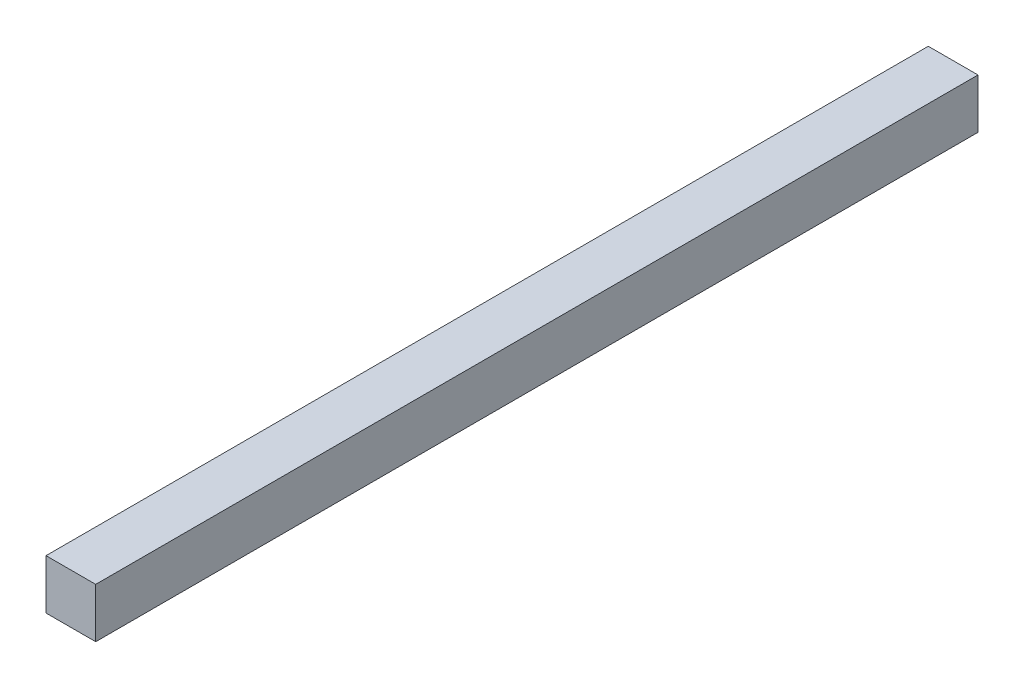
ISO-10303-21;
HEADER;
FILE_DESCRIPTION(('STEP AP214'),'2;1');
FILE_NAME('part.step','',(''),(''),'','','');
FILE_SCHEMA(('AUTOMOTIVE_DESIGN { 1 0 10303 214 1 1 1 1 }'));
ENDSEC;
DATA;
#1=APPLICATION_CONTEXT('core data for automotive mechanical design processes');
#2=APPLICATION_PROTOCOL_DEFINITION('international standard','automotive_design',2000,#1);
#3=PRODUCT_CONTEXT('',#1,'mechanical');
#4=PRODUCT('Part','Part','',(#3));
#5=PRODUCT_RELATED_PRODUCT_CATEGORY('part','',(#4));
#6=PRODUCT_DEFINITION_FORMATION('','',#4);
#7=PRODUCT_DEFINITION_CONTEXT('part definition',#1,'design');
#8=PRODUCT_DEFINITION('design','',#6,#7);
#9=PRODUCT_DEFINITION_SHAPE('','',#8);
#10=(LENGTH_UNIT() NAMED_UNIT(*) SI_UNIT(.MILLI.,.METRE.));
#11=(NAMED_UNIT(*) PLANE_ANGLE_UNIT() SI_UNIT($,.RADIAN.));
#12=(NAMED_UNIT(*) SI_UNIT($,.STERADIAN.) SOLID_ANGLE_UNIT());
#13=UNCERTAINTY_MEASURE_WITH_UNIT(LENGTH_MEASURE(1.E-05),#10,'distance_accuracy_value','');
#14=(GEOMETRIC_REPRESENTATION_CONTEXT(3) GLOBAL_UNCERTAINTY_ASSIGNED_CONTEXT((#13)) GLOBAL_UNIT_ASSIGNED_CONTEXT((#10,
#11,#12)) REPRESENTATION_CONTEXT('',''));
#15=CARTESIAN_POINT('',(0.,0.,0.));
#16=DIRECTION('',(0.,0.,1.));
#17=DIRECTION('',(1.,0.,0.));
#18=AXIS2_PLACEMENT_3D('',#15,#16,#17);
#19=CARTESIAN_POINT('',(-25.4358974358975,25.2307692307692,710.));
#20=DIRECTION('',(1.,0.,0.));
#21=DIRECTION('',(0.,1.,0.));
#22=AXIS2_PLACEMENT_3D('',#19,#20,#21);
#23=PLANE('',#22);
#24=DIRECTION('',(0.,-1.,0.));
#25=VECTOR('',#24,1.);
#26=CARTESIAN_POINT('',(-25.4358974358975,25.2307692307692,0.));
#27=LINE('',#26,#25);
#28=CARTESIAN_POINT('',(-25.4358974358975,25.2307692307692,0.));
#29=VERTEX_POINT('',#28);
#30=CARTESIAN_POINT('',(-25.4358974358975,-14.7692307692308,0.));
#31=VERTEX_POINT('',#30);
#32=EDGE_CURVE('E96',#29,#31,#27,.T.);
#33=ORIENTED_EDGE('',*,*,#32,.T.);
#34=DIRECTION('',(0.,0.,-1.));
#35=VECTOR('',#34,1.);
#36=CARTESIAN_POINT('',(-25.4358974358975,-14.7692307692308,710.));
#37=LINE('',#36,#35);
#38=CARTESIAN_POINT('',(-25.4358974358975,-14.7692307692308,710.));
#39=VERTEX_POINT('',#38);
#40=EDGE_CURVE('E11',#39,#31,#37,.T.);
#41=ORIENTED_EDGE('',*,*,#40,.F.);
#42=DIRECTION('',(0.,-1.,0.));
#43=VECTOR('',#42,1.);
#44=CARTESIAN_POINT('',(-25.4358974358975,25.2307692307692,710.));
#45=LINE('',#44,#43);
#46=CARTESIAN_POINT('',(-25.4358974358975,25.2307692307692,710.));
#47=VERTEX_POINT('',#46);
#48=EDGE_CURVE('E84',#47,#39,#45,.T.);
#49=ORIENTED_EDGE('',*,*,#48,.F.);
#50=DIRECTION('',(0.,0.,-1.));
#51=VECTOR('',#50,1.);
#52=CARTESIAN_POINT('',(-25.4358974358975,25.2307692307692,710.));
#53=LINE('',#52,#51);
#54=EDGE_CURVE('E92',#47,#29,#53,.T.);
#55=ORIENTED_EDGE('',*,*,#54,.T.);
#56=EDGE_LOOP('',(#33,#41,#49,#55));
#57=FACE_BOUND('',#56,.T.);
#58=ADVANCED_FACE('F33',(#57),#23,.F.);
#59=CARTESIAN_POINT('',(-25.4358974358975,-14.7692307692308,710.));
#60=DIRECTION('',(0.,1.,0.));
#61=DIRECTION('',(0.,0.,1.));
#62=AXIS2_PLACEMENT_3D('',#59,#60,#61);
#63=PLANE('',#62);
#64=DIRECTION('',(1.,0.,0.));
#65=VECTOR('',#64,1.);
#66=CARTESIAN_POINT('',(-25.4358974358975,-14.7692307692308,0.));
#67=LINE('',#66,#65);
#68=CARTESIAN_POINT('',(14.5641025641025,-14.7692307692308,0.));
#69=VERTEX_POINT('',#68);
#70=EDGE_CURVE('E88',#31,#69,#67,.T.);
#71=ORIENTED_EDGE('',*,*,#70,.T.);
#72=DIRECTION('',(0.,0.,-1.));
#73=VECTOR('',#72,1.);
#74=CARTESIAN_POINT('',(14.5641025641025,-14.7692307692308,710.));
#75=LINE('',#74,#73);
#76=CARTESIAN_POINT('',(14.5641025641025,-14.7692307692308,710.));
#77=VERTEX_POINT('',#76);
#78=EDGE_CURVE('E41',#77,#69,#75,.T.);
#79=ORIENTED_EDGE('',*,*,#78,.F.);
#80=DIRECTION('',(1.,0.,0.));
#81=VECTOR('',#80,1.);
#82=CARTESIAN_POINT('',(-25.4358974358975,-14.7692307692308,710.));
#83=LINE('',#82,#81);
#84=EDGE_CURVE('E79',#39,#77,#83,.T.);
#85=ORIENTED_EDGE('',*,*,#84,.F.);
#86=ORIENTED_EDGE('',*,*,#40,.T.);
#87=EDGE_LOOP('',(#71,#79,#85,#86));
#88=FACE_BOUND('',#87,.T.);
#89=ADVANCED_FACE('F87',(#88),#63,.F.);
#90=CARTESIAN_POINT('',(14.5641025641025,25.2307692307692,710.));
#91=DIRECTION('',(-1.,0.,0.));
#92=DIRECTION('',(0.,-1.,0.));
#93=AXIS2_PLACEMENT_3D('',#90,#91,#92);
#94=PLANE('',#93);
#95=DIRECTION('',(0.,1.,0.));
#96=VECTOR('',#95,1.);
#97=CARTESIAN_POINT('',(14.5641025641025,25.2307692307692,0.));
#98=LINE('',#97,#96);
#99=CARTESIAN_POINT('',(14.5641025641025,25.2307692307692,0.));
#100=VERTEX_POINT('',#99);
#101=EDGE_CURVE('E66',#69,#100,#98,.T.);
#102=ORIENTED_EDGE('',*,*,#101,.T.);
#103=DIRECTION('',(0.,0.,-1.));
#104=VECTOR('',#103,1.);
#105=CARTESIAN_POINT('',(14.5641025641025,25.2307692307692,710.));
#106=LINE('',#105,#104);
#107=CARTESIAN_POINT('',(14.5641025641025,25.2307692307692,710.));
#108=VERTEX_POINT('',#107);
#109=EDGE_CURVE('E89',#108,#100,#106,.T.);
#110=ORIENTED_EDGE('',*,*,#109,.F.);
#111=DIRECTION('',(0.,1.,0.));
#112=VECTOR('',#111,1.);
#113=CARTESIAN_POINT('',(14.5641025641025,25.2307692307692,710.));
#114=LINE('',#113,#112);
#115=EDGE_CURVE('E82',#77,#108,#114,.T.);
#116=ORIENTED_EDGE('',*,*,#115,.F.);
#117=ORIENTED_EDGE('',*,*,#78,.T.);
#118=EDGE_LOOP('',(#102,#110,#116,#117));
#119=FACE_BOUND('',#118,.T.);
#120=ADVANCED_FACE('F90',(#119),#94,.F.);
#121=CARTESIAN_POINT('',(-25.4358974358975,25.2307692307692,710.));
#122=DIRECTION('',(0.,-1.,0.));
#123=DIRECTION('',(0.,0.,-1.));
#124=AXIS2_PLACEMENT_3D('',#121,#122,#123);
#125=PLANE('',#124);
#126=DIRECTION('',(-1.,0.,0.));
#127=VECTOR('',#126,1.);
#128=CARTESIAN_POINT('',(-25.4358974358975,25.2307692307692,0.));
#129=LINE('',#128,#127);
#130=EDGE_CURVE('E72',#100,#29,#129,.T.);
#131=ORIENTED_EDGE('',*,*,#130,.T.);
#132=ORIENTED_EDGE('',*,*,#54,.F.);
#133=DIRECTION('',(-1.,0.,0.));
#134=VECTOR('',#133,1.);
#135=CARTESIAN_POINT('',(-25.4358974358975,25.2307692307692,710.));
#136=LINE('',#135,#134);
#137=EDGE_CURVE('E49',#108,#47,#136,.T.);
#138=ORIENTED_EDGE('',*,*,#137,.F.);
#139=ORIENTED_EDGE('',*,*,#109,.T.);
#140=EDGE_LOOP('',(#131,#132,#138,#139));
#141=FACE_BOUND('',#140,.T.);
#142=ADVANCED_FACE('F103',(#141),#125,.F.);
#143=CARTESIAN_POINT('',(0.,0.,710.));
#144=DIRECTION('',(0.,0.,1.));
#145=DIRECTION('',(1.,0.,0.));
#146=AXIS2_PLACEMENT_3D('',#143,#144,#145);
#147=PLANE('',#146);
#148=ORIENTED_EDGE('',*,*,#48,.T.);
#149=ORIENTED_EDGE('',*,*,#84,.T.);
#150=ORIENTED_EDGE('',*,*,#115,.T.);
#151=ORIENTED_EDGE('',*,*,#137,.T.);
#152=EDGE_LOOP('',(#148,#149,#150,#151));
#153=FACE_BOUND('',#152,.T.);
#154=ADVANCED_FACE('F80',(#153),#147,.T.);
#155=CARTESIAN_POINT('',(0.,0.,0.));
#156=DIRECTION('',(0.,0.,1.));
#157=DIRECTION('',(1.,0.,0.));
#158=AXIS2_PLACEMENT_3D('',#155,#156,#157);
#159=PLANE('',#158);
#160=ORIENTED_EDGE('',*,*,#32,.F.);
#161=ORIENTED_EDGE('',*,*,#130,.F.);
#162=ORIENTED_EDGE('',*,*,#101,.F.);
#163=ORIENTED_EDGE('',*,*,#70,.F.);
#164=EDGE_LOOP('',(#160,#161,#162,#163));
#165=FACE_BOUND('',#164,.T.);
#166=ADVANCED_FACE('F106',(#165),#159,.F.);
#167=CLOSED_SHELL('',(#58,#89,#120,#142,#154,#166));
#168=MANIFOLD_SOLID_BREP('B2',#167);
#169=ADVANCED_BREP_SHAPE_REPRESENTATION('',(#18,#168),#14);
#170=SHAPE_DEFINITION_REPRESENTATION(#9,#169);
ENDSEC;
END-ISO-10303-21;
